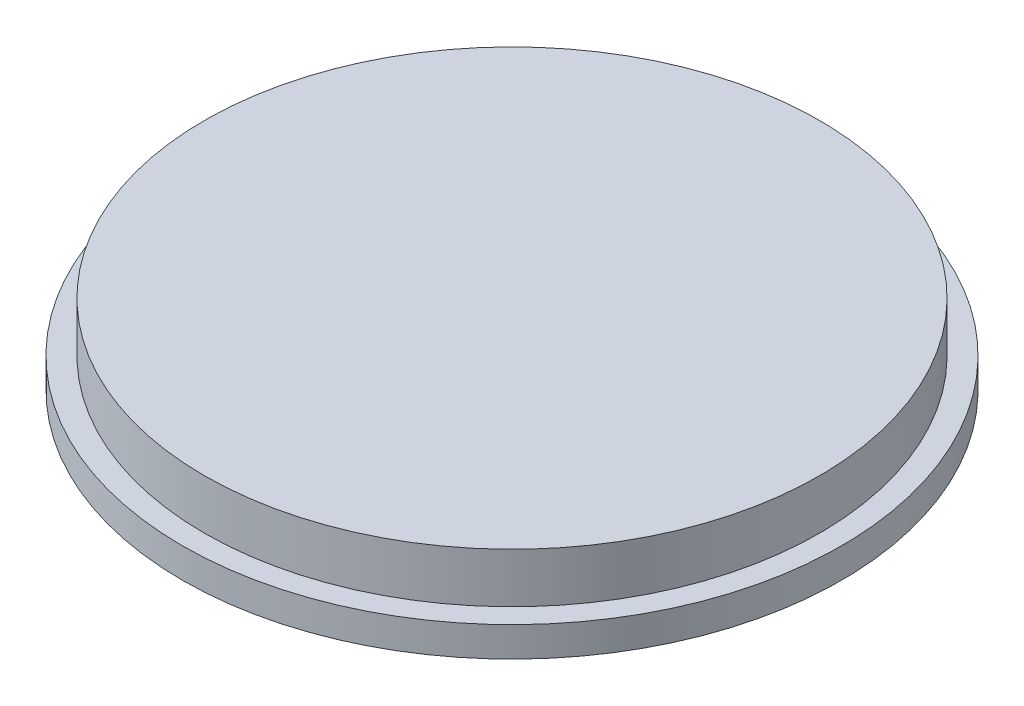
ISO-10303-21;
HEADER;
FILE_DESCRIPTION(('STEP AP214'),'2;1');
FILE_NAME('part.step','',(''),(''),'','','');
FILE_SCHEMA(('AUTOMOTIVE_DESIGN { 1 0 10303 214 1 1 1 1 }'));
ENDSEC;
DATA;
#1=APPLICATION_CONTEXT('core data for automotive mechanical design processes');
#2=APPLICATION_PROTOCOL_DEFINITION('international standard','automotive_design',2000,#1);
#3=PRODUCT_CONTEXT('',#1,'mechanical');
#4=PRODUCT('Part','Part','',(#3));
#5=PRODUCT_RELATED_PRODUCT_CATEGORY('part','',(#4));
#6=PRODUCT_DEFINITION_FORMATION('','',#4);
#7=PRODUCT_DEFINITION_CONTEXT('part definition',#1,'design');
#8=PRODUCT_DEFINITION('design','',#6,#7);
#9=PRODUCT_DEFINITION_SHAPE('','',#8);
#10=(LENGTH_UNIT() NAMED_UNIT(*) SI_UNIT(.MILLI.,.METRE.));
#11=(NAMED_UNIT(*) PLANE_ANGLE_UNIT() SI_UNIT($,.RADIAN.));
#12=(NAMED_UNIT(*) SI_UNIT($,.STERADIAN.) SOLID_ANGLE_UNIT());
#13=UNCERTAINTY_MEASURE_WITH_UNIT(LENGTH_MEASURE(1.E-05),#10,'distance_accuracy_value','');
#14=(GEOMETRIC_REPRESENTATION_CONTEXT(3) GLOBAL_UNCERTAINTY_ASSIGNED_CONTEXT((#13)) GLOBAL_UNIT_ASSIGNED_CONTEXT((#10,
#11,#12)) REPRESENTATION_CONTEXT('',''));
#15=CARTESIAN_POINT('',(0.,0.,0.));
#16=DIRECTION('',(0.,0.,1.));
#17=DIRECTION('',(1.,0.,0.));
#18=AXIS2_PLACEMENT_3D('',#15,#16,#17);
#19=CARTESIAN_POINT('',(0.,3.,0.));
#20=DIRECTION('',(0.,-1.,0.));
#21=DIRECTION('',(0.,0.,-1.));
#22=AXIS2_PLACEMENT_3D('',#19,#20,#21);
#23=CYLINDRICAL_SURFACE('',#22,33.1);
#24=CARTESIAN_POINT('',(0.,3.,0.));
#25=DIRECTION('',(0.,1.,0.));
#26=DIRECTION('',(0.,0.,1.));
#27=AXIS2_PLACEMENT_3D('',#24,#25,#26);
#28=CIRCLE('',#27,33.1);
#29=CARTESIAN_POINT('',(0.,3.,33.1));
#30=VERTEX_POINT('',#29);
#31=EDGE_CURVE('E45',#30,#30,#28,.T.);
#32=ORIENTED_EDGE('',*,*,#31,.F.);
#33=EDGE_LOOP('',(#32));
#34=FACE_BOUND('',#33,.T.);
#35=CARTESIAN_POINT('',(0.,0.,0.));
#36=DIRECTION('',(0.,1.,0.));
#37=DIRECTION('',(0.,0.,1.));
#38=AXIS2_PLACEMENT_3D('',#35,#36,#37);
#39=CIRCLE('',#38,33.1);
#40=CARTESIAN_POINT('',(0.,0.,33.1));
#41=VERTEX_POINT('',#40);
#42=EDGE_CURVE('E40',#41,#41,#39,.T.);
#43=ORIENTED_EDGE('',*,*,#42,.T.);
#44=EDGE_LOOP('',(#43));
#45=FACE_BOUND('',#44,.T.);
#46=ADVANCED_FACE('F37',(#34,#45),#23,.T.);
#47=CARTESIAN_POINT('',(0.,3.,0.));
#48=DIRECTION('',(0.,1.,0.));
#49=DIRECTION('',(0.,0.,1.));
#50=AXIS2_PLACEMENT_3D('',#47,#48,#49);
#51=PLANE('',#50);
#52=CARTESIAN_POINT('',(0.,3.,0.));
#53=DIRECTION('',(0.,1.,0.));
#54=DIRECTION('',(0.,0.,1.));
#55=AXIS2_PLACEMENT_3D('',#52,#53,#54);
#56=CIRCLE('',#55,30.9);
#57=CARTESIAN_POINT('',(0.,3.,30.9));
#58=VERTEX_POINT('',#57);
#59=EDGE_CURVE('E10',#58,#58,#56,.T.);
#60=ORIENTED_EDGE('',*,*,#59,.F.);
#61=EDGE_LOOP('',(#60));
#62=FACE_BOUND('',#61,.T.);
#63=ORIENTED_EDGE('',*,*,#31,.T.);
#64=EDGE_LOOP('',(#63));
#65=FACE_BOUND('',#64,.T.);
#66=ADVANCED_FACE('F65',(#62,#65),#51,.T.);
#67=CARTESIAN_POINT('',(0.,0.,0.));
#68=DIRECTION('',(0.,1.,0.));
#69=DIRECTION('',(0.,0.,1.));
#70=AXIS2_PLACEMENT_3D('',#67,#68,#69);
#71=PLANE('',#70);
#72=ORIENTED_EDGE('',*,*,#42,.F.);
#73=EDGE_LOOP('',(#72));
#74=FACE_BOUND('',#73,.T.);
#75=ADVANCED_FACE('F62',(#74),#71,.F.);
#76=CARTESIAN_POINT('',(0.,8.,0.));
#77=DIRECTION('',(0.,-1.,0.));
#78=DIRECTION('',(0.,0.,-1.));
#79=AXIS2_PLACEMENT_3D('',#76,#77,#78);
#80=CYLINDRICAL_SURFACE('',#79,30.9);
#81=CARTESIAN_POINT('',(0.,8.,0.));
#82=DIRECTION('',(0.,1.,0.));
#83=DIRECTION('',(0.,0.,1.));
#84=AXIS2_PLACEMENT_3D('',#81,#82,#83);
#85=CIRCLE('',#84,30.9);
#86=CARTESIAN_POINT('',(0.,8.,30.9));
#87=VERTEX_POINT('',#86);
#88=EDGE_CURVE('E52',#87,#87,#85,.T.);
#89=ORIENTED_EDGE('',*,*,#88,.F.);
#90=EDGE_LOOP('',(#89));
#91=FACE_BOUND('',#90,.T.);
#92=ORIENTED_EDGE('',*,*,#59,.T.);
#93=EDGE_LOOP('',(#92));
#94=FACE_BOUND('',#93,.T.);
#95=ADVANCED_FACE('F64',(#91,#94),#80,.T.);
#96=CARTESIAN_POINT('',(0.,8.,0.));
#97=DIRECTION('',(0.,1.,0.));
#98=DIRECTION('',(0.,0.,1.));
#99=AXIS2_PLACEMENT_3D('',#96,#97,#98);
#100=PLANE('',#99);
#101=ORIENTED_EDGE('',*,*,#88,.T.);
#102=EDGE_LOOP('',(#101));
#103=FACE_BOUND('',#102,.T.);
#104=ADVANCED_FACE('F70',(#103),#100,.T.);
#105=CLOSED_SHELL('',(#46,#66,#75,#95,#104));
#106=MANIFOLD_SOLID_BREP('B2',#105);
#107=ADVANCED_BREP_SHAPE_REPRESENTATION('',(#18,#106),#14);
#108=SHAPE_DEFINITION_REPRESENTATION(#9,#107);
ENDSEC;
END-ISO-10303-21;
